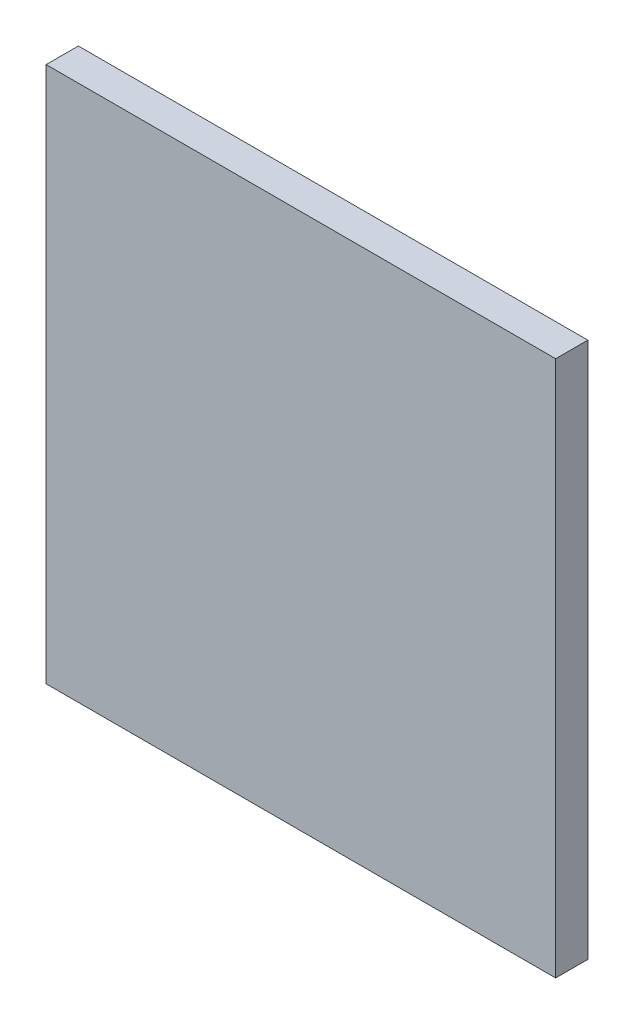
ISO-10303-21;
HEADER;
FILE_DESCRIPTION(('STEP AP214'),'2;1');
FILE_NAME('part.step','',(''),(''),'','','');
FILE_SCHEMA(('AUTOMOTIVE_DESIGN { 1 0 10303 214 1 1 1 1 }'));
ENDSEC;
DATA;
#1=APPLICATION_CONTEXT('core data for automotive mechanical design processes');
#2=APPLICATION_PROTOCOL_DEFINITION('international standard','automotive_design',2000,#1);
#3=PRODUCT_CONTEXT('',#1,'mechanical');
#4=PRODUCT('Part','Part','',(#3));
#5=PRODUCT_RELATED_PRODUCT_CATEGORY('part','',(#4));
#6=PRODUCT_DEFINITION_FORMATION('','',#4);
#7=PRODUCT_DEFINITION_CONTEXT('part definition',#1,'design');
#8=PRODUCT_DEFINITION('design','',#6,#7);
#9=PRODUCT_DEFINITION_SHAPE('','',#8);
#10=(LENGTH_UNIT() NAMED_UNIT(*) SI_UNIT(.MILLI.,.METRE.));
#11=(NAMED_UNIT(*) PLANE_ANGLE_UNIT() SI_UNIT($,.RADIAN.));
#12=(NAMED_UNIT(*) SI_UNIT($,.STERADIAN.) SOLID_ANGLE_UNIT());
#13=UNCERTAINTY_MEASURE_WITH_UNIT(LENGTH_MEASURE(1.E-05),#10,'distance_accuracy_value','');
#14=(GEOMETRIC_REPRESENTATION_CONTEXT(3) GLOBAL_UNCERTAINTY_ASSIGNED_CONTEXT((#13)) GLOBAL_UNIT_ASSIGNED_CONTEXT((#10,
#11,#12)) REPRESENTATION_CONTEXT('',''));
#15=CARTESIAN_POINT('',(0.,0.,0.));
#16=DIRECTION('',(0.,0.,1.));
#17=DIRECTION('',(1.,0.,0.));
#18=AXIS2_PLACEMENT_3D('',#15,#16,#17);
#19=CARTESIAN_POINT('',(-9.49999999999999,-10.,1.2));
#20=DIRECTION('',(1.,0.,0.));
#21=DIRECTION('',(0.,0.,-1.));
#22=AXIS2_PLACEMENT_3D('',#19,#20,#21);
#23=PLANE('',#22);
#24=DIRECTION('',(0.,-1.,0.));
#25=VECTOR('',#24,1.);
#26=CARTESIAN_POINT('',(-9.49999999999999,-10.,0.));
#27=LINE('',#26,#25);
#28=CARTESIAN_POINT('',(-9.49999999999999,9.99999999999999,0.));
#29=VERTEX_POINT('',#28);
#30=CARTESIAN_POINT('',(-9.49999999999999,-10.,0.));
#31=VERTEX_POINT('',#30);
#32=EDGE_CURVE('E102',#29,#31,#27,.T.);
#33=ORIENTED_EDGE('',*,*,#32,.T.);
#34=DIRECTION('',(0.,0.,-1.));
#35=VECTOR('',#34,1.);
#36=CARTESIAN_POINT('',(-9.49999999999999,-10.,1.2));
#37=LINE('',#36,#35);
#38=CARTESIAN_POINT('',(-9.49999999999999,-10.,1.2));
#39=VERTEX_POINT('',#38);
#40=EDGE_CURVE('E11',#39,#31,#37,.T.);
#41=ORIENTED_EDGE('',*,*,#40,.F.);
#42=DIRECTION('',(0.,-1.,0.));
#43=VECTOR('',#42,1.);
#44=CARTESIAN_POINT('',(-9.49999999999999,-10.,1.2));
#45=LINE('',#44,#43);
#46=CARTESIAN_POINT('',(-9.49999999999999,9.99999999999999,1.2));
#47=VERTEX_POINT('',#46);
#48=EDGE_CURVE('E90',#47,#39,#45,.T.);
#49=ORIENTED_EDGE('',*,*,#48,.F.);
#50=DIRECTION('',(0.,0.,-1.));
#51=VECTOR('',#50,1.);
#52=CARTESIAN_POINT('',(-9.49999999999999,9.99999999999999,1.2));
#53=LINE('',#52,#51);
#54=EDGE_CURVE('E98',#47,#29,#53,.T.);
#55=ORIENTED_EDGE('',*,*,#54,.T.);
#56=EDGE_LOOP('',(#33,#41,#49,#55));
#57=FACE_BOUND('',#56,.T.);
#58=ADVANCED_FACE('F39',(#57),#23,.F.);
#59=CARTESIAN_POINT('',(9.5,-10.,1.2));
#60=DIRECTION('',(0.,1.,0.));
#61=DIRECTION('',(-1.,0.,0.));
#62=AXIS2_PLACEMENT_3D('',#59,#60,#61);
#63=PLANE('',#62);
#64=DIRECTION('',(1.,0.,0.));
#65=VECTOR('',#64,1.);
#66=CARTESIAN_POINT('',(9.5,-10.,0.));
#67=LINE('',#66,#65);
#68=CARTESIAN_POINT('',(9.5,-10.,0.));
#69=VERTEX_POINT('',#68);
#70=EDGE_CURVE('E94',#31,#69,#67,.T.);
#71=ORIENTED_EDGE('',*,*,#70,.T.);
#72=DIRECTION('',(0.,0.,-1.));
#73=VECTOR('',#72,1.);
#74=CARTESIAN_POINT('',(9.5,-10.,1.2));
#75=LINE('',#74,#73);
#76=CARTESIAN_POINT('',(9.5,-10.,1.2));
#77=VERTEX_POINT('',#76);
#78=EDGE_CURVE('E47',#77,#69,#75,.T.);
#79=ORIENTED_EDGE('',*,*,#78,.F.);
#80=DIRECTION('',(1.,0.,0.));
#81=VECTOR('',#80,1.);
#82=CARTESIAN_POINT('',(9.5,-10.,1.2));
#83=LINE('',#82,#81);
#84=EDGE_CURVE('E85',#39,#77,#83,.T.);
#85=ORIENTED_EDGE('',*,*,#84,.F.);
#86=ORIENTED_EDGE('',*,*,#40,.T.);
#87=EDGE_LOOP('',(#71,#79,#85,#86));
#88=FACE_BOUND('',#87,.T.);
#89=ADVANCED_FACE('F93',(#88),#63,.F.);
#90=CARTESIAN_POINT('',(9.5,-10.,1.2));
#91=DIRECTION('',(-1.,0.,0.));
#92=DIRECTION('',(0.,0.,1.));
#93=AXIS2_PLACEMENT_3D('',#90,#91,#92);
#94=PLANE('',#93);
#95=DIRECTION('',(0.,1.,0.));
#96=VECTOR('',#95,1.);
#97=CARTESIAN_POINT('',(9.5,-10.,0.));
#98=LINE('',#97,#96);
#99=CARTESIAN_POINT('',(9.5,10.,0.));
#100=VERTEX_POINT('',#99);
#101=EDGE_CURVE('E72',#69,#100,#98,.T.);
#102=ORIENTED_EDGE('',*,*,#101,.T.);
#103=DIRECTION('',(0.,0.,-1.));
#104=VECTOR('',#103,1.);
#105=CARTESIAN_POINT('',(9.5,10.,1.2));
#106=LINE('',#105,#104);
#107=CARTESIAN_POINT('',(9.5,10.,1.2));
#108=VERTEX_POINT('',#107);
#109=EDGE_CURVE('E95',#108,#100,#106,.T.);
#110=ORIENTED_EDGE('',*,*,#109,.F.);
#111=DIRECTION('',(0.,1.,0.));
#112=VECTOR('',#111,1.);
#113=CARTESIAN_POINT('',(9.5,-10.,1.2));
#114=LINE('',#113,#112);
#115=EDGE_CURVE('E88',#77,#108,#114,.T.);
#116=ORIENTED_EDGE('',*,*,#115,.F.);
#117=ORIENTED_EDGE('',*,*,#78,.T.);
#118=EDGE_LOOP('',(#102,#110,#116,#117));
#119=FACE_BOUND('',#118,.T.);
#120=ADVANCED_FACE('F96',(#119),#94,.F.);
#121=CARTESIAN_POINT('',(9.5,10.,1.2));
#122=DIRECTION('',(0.,-1.,0.));
#123=DIRECTION('',(1.,0.,0.));
#124=AXIS2_PLACEMENT_3D('',#121,#122,#123);
#125=PLANE('',#124);
#126=DIRECTION('',(-1.,0.,0.));
#127=VECTOR('',#126,1.);
#128=CARTESIAN_POINT('',(9.5,10.,0.));
#129=LINE('',#128,#127);
#130=EDGE_CURVE('E78',#100,#29,#129,.T.);
#131=ORIENTED_EDGE('',*,*,#130,.T.);
#132=ORIENTED_EDGE('',*,*,#54,.F.);
#133=DIRECTION('',(-1.,0.,0.));
#134=VECTOR('',#133,1.);
#135=CARTESIAN_POINT('',(9.5,10.,1.2));
#136=LINE('',#135,#134);
#137=EDGE_CURVE('E55',#108,#47,#136,.T.);
#138=ORIENTED_EDGE('',*,*,#137,.F.);
#139=ORIENTED_EDGE('',*,*,#109,.T.);
#140=EDGE_LOOP('',(#131,#132,#138,#139));
#141=FACE_BOUND('',#140,.T.);
#142=ADVANCED_FACE('F109',(#141),#125,.F.);
#143=CARTESIAN_POINT('',(0.,0.,1.2));
#144=DIRECTION('',(0.,0.,1.));
#145=DIRECTION('',(1.,0.,0.));
#146=AXIS2_PLACEMENT_3D('',#143,#144,#145);
#147=PLANE('',#146);
#148=ORIENTED_EDGE('',*,*,#48,.T.);
#149=ORIENTED_EDGE('',*,*,#84,.T.);
#150=ORIENTED_EDGE('',*,*,#115,.T.);
#151=ORIENTED_EDGE('',*,*,#137,.T.);
#152=EDGE_LOOP('',(#148,#149,#150,#151));
#153=FACE_BOUND('',#152,.T.);
#154=ADVANCED_FACE('F86',(#153),#147,.T.);
#155=CARTESIAN_POINT('',(0.,0.,0.));
#156=DIRECTION('',(0.,0.,1.));
#157=DIRECTION('',(1.,0.,0.));
#158=AXIS2_PLACEMENT_3D('',#155,#156,#157);
#159=PLANE('',#158);
#160=ORIENTED_EDGE('',*,*,#32,.F.);
#161=ORIENTED_EDGE('',*,*,#130,.F.);
#162=ORIENTED_EDGE('',*,*,#101,.F.);
#163=ORIENTED_EDGE('',*,*,#70,.F.);
#164=EDGE_LOOP('',(#160,#161,#162,#163));
#165=FACE_BOUND('',#164,.T.);
#166=ADVANCED_FACE('F112',(#165),#159,.F.);
#167=CLOSED_SHELL('',(#58,#89,#120,#142,#154,#166));
#168=MANIFOLD_SOLID_BREP('B2',#167);
#169=ADVANCED_BREP_SHAPE_REPRESENTATION('',(#18,#168),#14);
#170=SHAPE_DEFINITION_REPRESENTATION(#9,#169);
ENDSEC;
END-ISO-10303-21;
